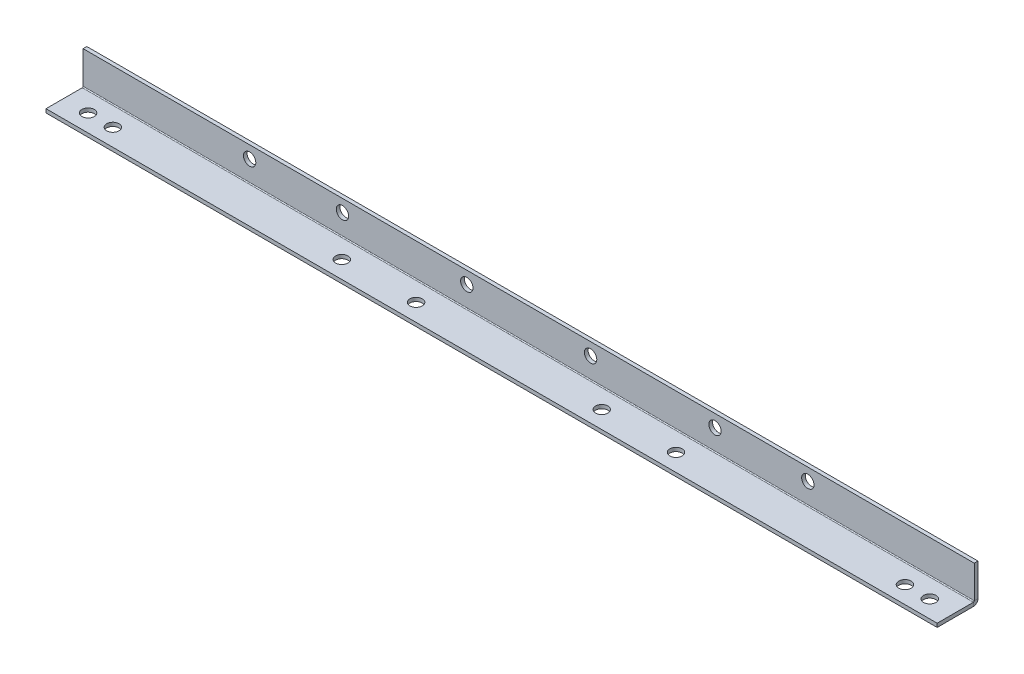
ISO-10303-21;
HEADER;
FILE_DESCRIPTION(('STEP AP214'),'2;1');
FILE_NAME('part.step','',(''),(''),'','','');
FILE_SCHEMA(('AUTOMOTIVE_DESIGN { 1 0 10303 214 1 1 1 1 }'));
ENDSEC;
DATA;
#1=APPLICATION_CONTEXT('core data for automotive mechanical design processes');
#2=APPLICATION_PROTOCOL_DEFINITION('international standard','automotive_design',2000,#1);
#3=PRODUCT_CONTEXT('',#1,'mechanical');
#4=PRODUCT('Part','Part','',(#3));
#5=PRODUCT_RELATED_PRODUCT_CATEGORY('part','',(#4));
#6=PRODUCT_DEFINITION_FORMATION('','',#4);
#7=PRODUCT_DEFINITION_CONTEXT('part definition',#1,'design');
#8=PRODUCT_DEFINITION('design','',#6,#7);
#9=PRODUCT_DEFINITION_SHAPE('','',#8);
#10=(LENGTH_UNIT() NAMED_UNIT(*) SI_UNIT(.MILLI.,.METRE.));
#11=(NAMED_UNIT(*) PLANE_ANGLE_UNIT() SI_UNIT($,.RADIAN.));
#12=(NAMED_UNIT(*) SI_UNIT($,.STERADIAN.) SOLID_ANGLE_UNIT());
#13=UNCERTAINTY_MEASURE_WITH_UNIT(LENGTH_MEASURE(1.E-05),#10,'distance_accuracy_value','');
#14=(GEOMETRIC_REPRESENTATION_CONTEXT(3) GLOBAL_UNCERTAINTY_ASSIGNED_CONTEXT((#13)) GLOBAL_UNIT_ASSIGNED_CONTEXT((#10,
#11,#12)) REPRESENTATION_CONTEXT('',''));
#15=CARTESIAN_POINT('',(0.,0.,0.));
#16=DIRECTION('',(0.,0.,1.));
#17=DIRECTION('',(1.,0.,0.));
#18=AXIS2_PLACEMENT_3D('',#15,#16,#17);
#19=CARTESIAN_POINT('',(-360.,-3.,15.));
#20=DIRECTION('',(-1.,0.,0.));
#21=DIRECTION('',(0.,0.,1.));
#22=AXIS2_PLACEMENT_3D('',#19,#20,#21);
#23=PLANE('',#22);
#24=DIRECTION('',(0.,0.,1.));
#25=VECTOR('',#24,1.);
#26=CARTESIAN_POINT('',(-360.,0.,15.));
#27=LINE('',#26,#25);
#28=CARTESIAN_POINT('',(-359.999999999999,0.,-14.2634));
#29=VERTEX_POINT('',#28);
#30=CARTESIAN_POINT('',(-360.,0.,15.));
#31=VERTEX_POINT('',#30);
#32=EDGE_CURVE('E90',#29,#31,#27,.T.);
#33=ORIENTED_EDGE('',*,*,#32,.F.);
#34=DIRECTION('',(0.,-1.,0.));
#35=VECTOR('',#34,1.);
#36=CARTESIAN_POINT('',(-359.999999999999,0.,-14.2634));
#37=LINE('',#36,#35);
#38=CARTESIAN_POINT('',(-359.999999999999,-3.00000000000001,-14.2634));
#39=VERTEX_POINT('',#38);
#40=EDGE_CURVE('E108',#29,#39,#37,.T.);
#41=ORIENTED_EDGE('',*,*,#40,.T.);
#42=DIRECTION('',(0.,0.,1.));
#43=VECTOR('',#42,1.);
#44=CARTESIAN_POINT('',(-360.,-3.,15.));
#45=LINE('',#44,#43);
#46=CARTESIAN_POINT('',(-360.,-3.,15.));
#47=VERTEX_POINT('',#46);
#48=EDGE_CURVE('E100',#39,#47,#45,.T.);
#49=ORIENTED_EDGE('',*,*,#48,.T.);
#50=DIRECTION('',(0.,1.,0.));
#51=VECTOR('',#50,1.);
#52=CARTESIAN_POINT('',(-360.,-3.,15.));
#53=LINE('',#52,#51);
#54=EDGE_CURVE('E44',#47,#31,#53,.T.);
#55=ORIENTED_EDGE('',*,*,#54,.T.);
#56=EDGE_LOOP('',(#33,#41,#49,#55));
#57=FACE_BOUND('',#56,.T.);
#58=ADVANCED_FACE('F40',(#57),#23,.T.);
#59=CARTESIAN_POINT('',(0.,-3.,0.));
#60=DIRECTION('',(0.,-1.,0.));
#61=DIRECTION('',(0.,0.,-1.));
#62=AXIS2_PLACEMENT_3D('',#59,#60,#61);
#63=PLANE('',#62);
#64=CARTESIAN_POINT('',(-135.,-3.,1.00000000000001));
#65=DIRECTION('',(0.,-1.,0.));
#66=DIRECTION('',(0.,0.,-1.));
#67=AXIS2_PLACEMENT_3D('',#64,#65,#66);
#68=CIRCLE('',#67,4.99999999999999);
#69=CARTESIAN_POINT('',(-135.,-3.,-3.99999999999998));
#70=VERTEX_POINT('',#69);
#71=EDGE_CURVE('E260',#70,#70,#68,.T.);
#72=ORIENTED_EDGE('',*,*,#71,.F.);
#73=EDGE_LOOP('',(#72));
#74=FACE_BOUND('',#73,.T.);
#75=CARTESIAN_POINT('',(135.,-3.,1.00000000000001));
#76=DIRECTION('',(0.,-1.,0.));
#77=DIRECTION('',(0.,0.,-1.));
#78=AXIS2_PLACEMENT_3D('',#75,#76,#77);
#79=CIRCLE('',#78,4.99999999999999);
#80=CARTESIAN_POINT('',(135.,-3.,-3.99999999999998));
#81=VERTEX_POINT('',#80);
#82=EDGE_CURVE('E267',#81,#81,#79,.T.);
#83=ORIENTED_EDGE('',*,*,#82,.F.);
#84=EDGE_LOOP('',(#83));
#85=FACE_BOUND('',#84,.T.);
#86=CARTESIAN_POINT('',(75.,-3.,1.00000000000001));
#87=DIRECTION('',(0.,-1.,0.));
#88=DIRECTION('',(0.,0.,-1.));
#89=AXIS2_PLACEMENT_3D('',#86,#87,#88);
#90=CIRCLE('',#89,5.);
#91=CARTESIAN_POINT('',(75.,-3.,-3.99999999999999));
#92=VERTEX_POINT('',#91);
#93=EDGE_CURVE('E271',#92,#92,#90,.T.);
#94=ORIENTED_EDGE('',*,*,#93,.F.);
#95=EDGE_LOOP('',(#94));
#96=FACE_BOUND('',#95,.T.);
#97=CARTESIAN_POINT('',(-75.,-3.,1.00000000000001));
#98=DIRECTION('',(0.,-1.,0.));
#99=DIRECTION('',(0.,0.,-1.));
#100=AXIS2_PLACEMENT_3D('',#97,#98,#99);
#101=CIRCLE('',#100,5.);
#102=CARTESIAN_POINT('',(-75.,-3.,-3.99999999999999));
#103=VERTEX_POINT('',#102);
#104=EDGE_CURVE('E275',#103,#103,#101,.T.);
#105=ORIENTED_EDGE('',*,*,#104,.F.);
#106=EDGE_LOOP('',(#105));
#107=FACE_BOUND('',#106,.T.);
#108=CARTESIAN_POINT('',(339.999999999999,-3.,1.00000000000001));
#109=DIRECTION('',(0.,-1.,0.));
#110=DIRECTION('',(0.,0.,-1.));
#111=AXIS2_PLACEMENT_3D('',#108,#109,#110);
#112=CIRCLE('',#111,4.99999999999999);
#113=CARTESIAN_POINT('',(339.999999999999,-3.,-3.99999999999998));
#114=VERTEX_POINT('',#113);
#115=EDGE_CURVE('E196',#114,#114,#112,.F.);
#116=ORIENTED_EDGE('',*,*,#115,.T.);
#117=EDGE_LOOP('',(#116));
#118=FACE_BOUND('',#117,.T.);
#119=CARTESIAN_POINT('',(319.999999999999,-3.,1.00000000000001));
#120=DIRECTION('',(0.,-1.,0.));
#121=DIRECTION('',(0.,0.,-1.));
#122=AXIS2_PLACEMENT_3D('',#119,#120,#121);
#123=CIRCLE('',#122,4.99999999999999);
#124=CARTESIAN_POINT('',(319.999999999999,-3.,-3.99999999999998));
#125=VERTEX_POINT('',#124);
#126=EDGE_CURVE('E203',#125,#125,#123,.F.);
#127=ORIENTED_EDGE('',*,*,#126,.T.);
#128=EDGE_LOOP('',(#127));
#129=FACE_BOUND('',#128,.T.);
#130=CARTESIAN_POINT('',(-339.999999999999,-3.,1.00000000000001));
#131=DIRECTION('',(0.,-1.,0.));
#132=DIRECTION('',(0.,0.,-1.));
#133=AXIS2_PLACEMENT_3D('',#130,#131,#132);
#134=CIRCLE('',#133,4.99999999999999);
#135=CARTESIAN_POINT('',(-339.999999999999,-3.,-3.99999999999998));
#136=VERTEX_POINT('',#135);
#137=EDGE_CURVE('E177',#136,#136,#134,.T.);
#138=ORIENTED_EDGE('',*,*,#137,.F.);
#139=EDGE_LOOP('',(#138));
#140=FACE_BOUND('',#139,.T.);
#141=CARTESIAN_POINT('',(-319.999999999999,-3.,1.00000000000001));
#142=DIRECTION('',(0.,-1.,0.));
#143=DIRECTION('',(0.,0.,-1.));
#144=AXIS2_PLACEMENT_3D('',#141,#142,#143);
#145=CIRCLE('',#144,4.99999999999999);
#146=CARTESIAN_POINT('',(-319.999999999999,-3.,-3.99999999999998));
#147=VERTEX_POINT('',#146);
#148=EDGE_CURVE('E187',#147,#147,#145,.T.);
#149=ORIENTED_EDGE('',*,*,#148,.F.);
#150=EDGE_LOOP('',(#149));
#151=FACE_BOUND('',#150,.T.);
#152=ORIENTED_EDGE('',*,*,#48,.F.);
#153=DIRECTION('',(-1.,0.,0.));
#154=VECTOR('',#153,1.);
#155=CARTESIAN_POINT('',(-359.999999999999,-3.00000000000001,-14.2634));
#156=LINE('',#155,#154);
#157=CARTESIAN_POINT('',(360.,-3.,-14.2634));
#158=VERTEX_POINT('',#157);
#159=EDGE_CURVE('E131',#39,#158,#156,.F.);
#160=ORIENTED_EDGE('',*,*,#159,.T.);
#161=DIRECTION('',(0.,0.,-1.));
#162=VECTOR('',#161,1.);
#163=CARTESIAN_POINT('',(360.,-3.,15.));
#164=LINE('',#163,#162);
#165=CARTESIAN_POINT('',(360.,-3.,15.));
#166=VERTEX_POINT('',#165);
#167=EDGE_CURVE('E96',#166,#158,#164,.T.);
#168=ORIENTED_EDGE('',*,*,#167,.F.);
#169=DIRECTION('',(1.,0.,0.));
#170=VECTOR('',#169,1.);
#171=CARTESIAN_POINT('',(-360.,-3.,15.));
#172=LINE('',#171,#170);
#173=EDGE_CURVE('E81',#47,#166,#172,.T.);
#174=ORIENTED_EDGE('',*,*,#173,.F.);
#175=EDGE_LOOP('',(#152,#160,#168,#174));
#176=FACE_BOUND('',#175,.T.);
#177=ADVANCED_FACE('F300',(#74,#85,#96,#107,#118,#129,#140,#151,#176),#63,.T.);
#178=CARTESIAN_POINT('',(0.,0.,0.));
#179=DIRECTION('',(0.,-1.,0.));
#180=DIRECTION('',(0.,0.,-1.));
#181=AXIS2_PLACEMENT_3D('',#178,#179,#180);
#182=PLANE('',#181);
#183=CARTESIAN_POINT('',(-135.,0.,1.00000000000001));
#184=DIRECTION('',(0.,1.,0.));
#185=DIRECTION('',(0.,0.,1.));
#186=AXIS2_PLACEMENT_3D('',#183,#184,#185);
#187=CIRCLE('',#186,4.99999999999999);
#188=CARTESIAN_POINT('',(-135.,0.,6.));
#189=VERTEX_POINT('',#188);
#190=EDGE_CURVE('E284',#189,#189,#187,.T.);
#191=ORIENTED_EDGE('',*,*,#190,.F.);
#192=EDGE_LOOP('',(#191));
#193=FACE_BOUND('',#192,.T.);
#194=CARTESIAN_POINT('',(135.,0.,1.00000000000001));
#195=DIRECTION('',(0.,1.,0.));
#196=DIRECTION('',(0.,0.,1.));
#197=AXIS2_PLACEMENT_3D('',#194,#195,#196);
#198=CIRCLE('',#197,4.99999999999999);
#199=CARTESIAN_POINT('',(135.,0.,6.));
#200=VERTEX_POINT('',#199);
#201=EDGE_CURVE('E288',#200,#200,#198,.T.);
#202=ORIENTED_EDGE('',*,*,#201,.F.);
#203=EDGE_LOOP('',(#202));
#204=FACE_BOUND('',#203,.T.);
#205=CARTESIAN_POINT('',(75.,0.,1.00000000000001));
#206=DIRECTION('',(0.,1.,0.));
#207=DIRECTION('',(0.,0.,1.));
#208=AXIS2_PLACEMENT_3D('',#205,#206,#207);
#209=CIRCLE('',#208,5.);
#210=CARTESIAN_POINT('',(75.,0.,6.00000000000002));
#211=VERTEX_POINT('',#210);
#212=EDGE_CURVE('E283',#211,#211,#209,.T.);
#213=ORIENTED_EDGE('',*,*,#212,.F.);
#214=EDGE_LOOP('',(#213));
#215=FACE_BOUND('',#214,.T.);
#216=CARTESIAN_POINT('',(-75.,0.,1.00000000000001));
#217=DIRECTION('',(0.,1.,0.));
#218=DIRECTION('',(0.,0.,1.));
#219=AXIS2_PLACEMENT_3D('',#216,#217,#218);
#220=CIRCLE('',#219,5.);
#221=CARTESIAN_POINT('',(-75.,0.,6.00000000000002));
#222=VERTEX_POINT('',#221);
#223=EDGE_CURVE('E279',#222,#222,#220,.T.);
#224=ORIENTED_EDGE('',*,*,#223,.F.);
#225=EDGE_LOOP('',(#224));
#226=FACE_BOUND('',#225,.T.);
#227=CARTESIAN_POINT('',(339.999999999999,0.,1.00000000000001));
#228=DIRECTION('',(0.,-1.,0.));
#229=DIRECTION('',(0.,0.,1.));
#230=AXIS2_PLACEMENT_3D('',#227,#228,#229);
#231=CIRCLE('',#230,4.99999999999999);
#232=CARTESIAN_POINT('',(339.999999999999,0.,6.));
#233=VERTEX_POINT('',#232);
#234=EDGE_CURVE('E207',#233,#233,#231,.T.);
#235=ORIENTED_EDGE('',*,*,#234,.T.);
#236=EDGE_LOOP('',(#235));
#237=FACE_BOUND('',#236,.T.);
#238=CARTESIAN_POINT('',(319.999999999999,0.,1.00000000000001));
#239=DIRECTION('',(0.,-1.,0.));
#240=DIRECTION('',(0.,0.,1.));
#241=AXIS2_PLACEMENT_3D('',#238,#239,#240);
#242=CIRCLE('',#241,4.99999999999999);
#243=CARTESIAN_POINT('',(319.999999999999,0.,6.));
#244=VERTEX_POINT('',#243);
#245=EDGE_CURVE('E208',#244,#244,#242,.T.);
#246=ORIENTED_EDGE('',*,*,#245,.T.);
#247=EDGE_LOOP('',(#246));
#248=FACE_BOUND('',#247,.T.);
#249=CARTESIAN_POINT('',(-339.999999999999,0.,1.00000000000001));
#250=DIRECTION('',(0.,1.,0.));
#251=DIRECTION('',(0.,0.,1.));
#252=AXIS2_PLACEMENT_3D('',#249,#250,#251);
#253=CIRCLE('',#252,4.99999999999999);
#254=CARTESIAN_POINT('',(-339.999999999999,0.,6.));
#255=VERTEX_POINT('',#254);
#256=EDGE_CURVE('E191',#255,#255,#253,.T.);
#257=ORIENTED_EDGE('',*,*,#256,.F.);
#258=EDGE_LOOP('',(#257));
#259=FACE_BOUND('',#258,.T.);
#260=CARTESIAN_POINT('',(-319.999999999999,0.,1.00000000000001));
#261=DIRECTION('',(0.,1.,0.));
#262=DIRECTION('',(0.,0.,1.));
#263=AXIS2_PLACEMENT_3D('',#260,#261,#262);
#264=CIRCLE('',#263,4.99999999999999);
#265=CARTESIAN_POINT('',(-319.999999999999,0.,6.));
#266=VERTEX_POINT('',#265);
#267=EDGE_CURVE('E192',#266,#266,#264,.T.);
#268=ORIENTED_EDGE('',*,*,#267,.F.);
#269=EDGE_LOOP('',(#268));
#270=FACE_BOUND('',#269,.T.);
#271=DIRECTION('',(-1.,0.,0.));
#272=VECTOR('',#271,1.);
#273=CARTESIAN_POINT('',(-359.999999999999,0.,-14.2634));
#274=LINE('',#273,#272);
#275=CARTESIAN_POINT('',(360.,0.,-14.2634));
#276=VERTEX_POINT('',#275);
#277=EDGE_CURVE('E118',#29,#276,#274,.F.);
#278=ORIENTED_EDGE('',*,*,#277,.F.);
#279=ORIENTED_EDGE('',*,*,#32,.T.);
#280=DIRECTION('',(1.,0.,0.));
#281=VECTOR('',#280,1.);
#282=CARTESIAN_POINT('',(-360.,0.,15.));
#283=LINE('',#282,#281);
#284=CARTESIAN_POINT('',(360.,0.,15.));
#285=VERTEX_POINT('',#284);
#286=EDGE_CURVE('E79',#31,#285,#283,.T.);
#287=ORIENTED_EDGE('',*,*,#286,.T.);
#288=DIRECTION('',(0.,0.,-1.));
#289=VECTOR('',#288,1.);
#290=CARTESIAN_POINT('',(360.,0.,15.));
#291=LINE('',#290,#289);
#292=EDGE_CURVE('E84',#285,#276,#291,.T.);
#293=ORIENTED_EDGE('',*,*,#292,.T.);
#294=EDGE_LOOP('',(#278,#279,#287,#293));
#295=FACE_BOUND('',#294,.T.);
#296=ADVANCED_FACE('F92',(#193,#204,#215,#226,#237,#248,#259,#270,#295),#182,.F.);
#297=CARTESIAN_POINT('',(360.,-3.,15.));
#298=DIRECTION('',(1.,0.,0.));
#299=DIRECTION('',(0.,0.,-1.));
#300=AXIS2_PLACEMENT_3D('',#297,#298,#299);
#301=PLANE('',#300);
#302=DIRECTION('',(0.,-1.,0.));
#303=VECTOR('',#302,1.);
#304=CARTESIAN_POINT('',(360.,0.,-14.2634));
#305=LINE('',#304,#303);
#306=EDGE_CURVE('E86',#276,#158,#305,.T.);
#307=ORIENTED_EDGE('',*,*,#306,.F.);
#308=ORIENTED_EDGE('',*,*,#292,.F.);
#309=DIRECTION('',(0.,1.,0.));
#310=VECTOR('',#309,1.);
#311=CARTESIAN_POINT('',(360.,-3.,15.));
#312=LINE('',#311,#310);
#313=EDGE_CURVE('E11',#166,#285,#312,.T.);
#314=ORIENTED_EDGE('',*,*,#313,.F.);
#315=ORIENTED_EDGE('',*,*,#167,.T.);
#316=EDGE_LOOP('',(#307,#308,#314,#315));
#317=FACE_BOUND('',#316,.T.);
#318=ADVANCED_FACE('F42',(#317),#301,.T.);
#319=CARTESIAN_POINT('',(-360.,-3.,15.));
#320=DIRECTION('',(0.,0.,1.));
#321=DIRECTION('',(1.,0.,0.));
#322=AXIS2_PLACEMENT_3D('',#319,#320,#321);
#323=PLANE('',#322);
#324=ORIENTED_EDGE('',*,*,#286,.F.);
#325=ORIENTED_EDGE('',*,*,#54,.F.);
#326=ORIENTED_EDGE('',*,*,#173,.T.);
#327=ORIENTED_EDGE('',*,*,#313,.T.);
#328=EDGE_LOOP('',(#324,#325,#326,#327));
#329=FACE_BOUND('',#328,.T.);
#330=ADVANCED_FACE('F76',(#329),#323,.T.);
#331=CARTESIAN_POINT('',(360.,0.736599999999992,-14.2634));
#332=DIRECTION('',(1.,0.,0.));
#333=DIRECTION('',(0.,0.,-1.));
#334=AXIS2_PLACEMENT_3D('',#331,#332,#333);
#335=PLANE('',#334);
#336=DIRECTION('',(0.,0.,-1.));
#337=VECTOR('',#336,1.);
#338=CARTESIAN_POINT('',(360.,0.736599999999997,-15.));
#339=LINE('',#338,#337);
#340=CARTESIAN_POINT('',(360.,0.736599999999989,-15.));
#341=VERTEX_POINT('',#340);
#342=CARTESIAN_POINT('',(360.,0.736599999999979,-18.));
#343=VERTEX_POINT('',#342);
#344=EDGE_CURVE('E172',#341,#343,#339,.T.);
#345=ORIENTED_EDGE('',*,*,#344,.F.);
#346=CARTESIAN_POINT('',(360.,0.736599999999992,-14.2634));
#347=DIRECTION('',(-1.,0.,0.));
#348=DIRECTION('',(0.,0.,1.));
#349=AXIS2_PLACEMENT_3D('',#346,#347,#348);
#350=CIRCLE('',#349,0.7366);
#351=EDGE_CURVE('E123',#276,#341,#350,.F.);
#352=ORIENTED_EDGE('',*,*,#351,.F.);
#353=ORIENTED_EDGE('',*,*,#306,.T.);
#354=CARTESIAN_POINT('',(360.,0.736599999999992,-14.2634));
#355=DIRECTION('',(-1.,0.,0.));
#356=DIRECTION('',(0.,0.,1.));
#357=AXIS2_PLACEMENT_3D('',#354,#355,#356);
#358=CIRCLE('',#357,3.7366);
#359=EDGE_CURVE('E56',#158,#343,#358,.F.);
#360=ORIENTED_EDGE('',*,*,#359,.T.);
#361=EDGE_LOOP('',(#345,#352,#353,#360));
#362=FACE_BOUND('',#361,.T.);
#363=ADVANCED_FACE('F339',(#362),#335,.T.);
#364=CARTESIAN_POINT('',(-359.999999999999,0.736599999999992,-14.2634));
#365=DIRECTION('',(1.,0.,0.));
#366=DIRECTION('',(0.,0.,-1.));
#367=AXIS2_PLACEMENT_3D('',#364,#365,#366);
#368=PLANE('',#367);
#369=CARTESIAN_POINT('',(-359.999999999999,0.736599999999992,-14.2634));
#370=DIRECTION('',(-1.,0.,0.));
#371=DIRECTION('',(0.,0.,1.));
#372=AXIS2_PLACEMENT_3D('',#369,#370,#371);
#373=CIRCLE('',#372,0.7366);
#374=CARTESIAN_POINT('',(-359.999999999999,0.736599999999989,-15.));
#375=VERTEX_POINT('',#374);
#376=EDGE_CURVE('E114',#375,#29,#373,.T.);
#377=ORIENTED_EDGE('',*,*,#376,.F.);
#378=DIRECTION('',(0.,0.,-1.));
#379=VECTOR('',#378,1.);
#380=CARTESIAN_POINT('',(-359.999999999999,0.736599999999997,-15.));
#381=LINE('',#380,#379);
#382=CARTESIAN_POINT('',(-359.999999999999,0.736600000000018,-18.));
#383=VERTEX_POINT('',#382);
#384=EDGE_CURVE('E171',#375,#383,#381,.T.);
#385=ORIENTED_EDGE('',*,*,#384,.T.);
#386=CARTESIAN_POINT('',(-359.999999999999,0.736599999999992,-14.2634));
#387=DIRECTION('',(-1.,0.,0.));
#388=DIRECTION('',(0.,0.,1.));
#389=AXIS2_PLACEMENT_3D('',#386,#387,#388);
#390=CIRCLE('',#389,3.7366);
#391=EDGE_CURVE('E127',#383,#39,#390,.T.);
#392=ORIENTED_EDGE('',*,*,#391,.T.);
#393=ORIENTED_EDGE('',*,*,#40,.F.);
#394=EDGE_LOOP('',(#377,#385,#392,#393));
#395=FACE_BOUND('',#394,.T.);
#396=ADVANCED_FACE('F341',(#395),#368,.F.);
#397=CARTESIAN_POINT('',(-359.999999999999,0.736599999999992,-14.2634));
#398=DIRECTION('',(-1.,0.,0.));
#399=DIRECTION('',(0.,0.,-1.));
#400=AXIS2_PLACEMENT_3D('',#397,#398,#399);
#401=CYLINDRICAL_SURFACE('',#400,3.7366);
#402=ORIENTED_EDGE('',*,*,#159,.F.);
#403=ORIENTED_EDGE('',*,*,#391,.F.);
#404=DIRECTION('',(1.,0.,0.));
#405=VECTOR('',#404,1.);
#406=CARTESIAN_POINT('',(0.,0.736600000000018,-18.));
#407=LINE('',#406,#405);
#408=EDGE_CURVE('E158',#383,#343,#407,.T.);
#409=ORIENTED_EDGE('',*,*,#408,.T.);
#410=ORIENTED_EDGE('',*,*,#359,.F.);
#411=EDGE_LOOP('',(#402,#403,#409,#410));
#412=FACE_BOUND('',#411,.T.);
#413=ADVANCED_FACE('F344',(#412),#401,.T.);
#414=CARTESIAN_POINT('',(-359.999999999999,0.736599999999992,-14.2634));
#415=DIRECTION('',(-1.,0.,0.));
#416=DIRECTION('',(0.,0.,-1.));
#417=AXIS2_PLACEMENT_3D('',#414,#415,#416);
#418=CYLINDRICAL_SURFACE('',#417,0.7366);
#419=ORIENTED_EDGE('',*,*,#277,.T.);
#420=ORIENTED_EDGE('',*,*,#351,.T.);
#421=DIRECTION('',(-1.,0.,0.));
#422=VECTOR('',#421,1.);
#423=CARTESIAN_POINT('',(360.,0.736599999999997,-15.));
#424=LINE('',#423,#422);
#425=EDGE_CURVE('E176',#341,#375,#424,.T.);
#426=ORIENTED_EDGE('',*,*,#425,.T.);
#427=ORIENTED_EDGE('',*,*,#376,.T.);
#428=EDGE_LOOP('',(#419,#420,#426,#427));
#429=FACE_BOUND('',#428,.T.);
#430=ADVANCED_FACE('F349',(#429),#418,.F.);
#431=CARTESIAN_POINT('',(-359.999999999999,27.,-18.0000000000001));
#432=DIRECTION('',(1.,0.,0.));
#433=DIRECTION('',(0.,0.,-1.));
#434=AXIS2_PLACEMENT_3D('',#431,#432,#433);
#435=PLANE('',#434);
#436=ORIENTED_EDGE('',*,*,#384,.F.);
#437=DIRECTION('',(0.,1.,0.));
#438=VECTOR('',#437,1.);
#439=CARTESIAN_POINT('',(-359.999999999999,27.,-15.0000000000001));
#440=LINE('',#439,#438);
#441=CARTESIAN_POINT('',(-359.999999999999,27.,-15.0000000000001));
#442=VERTEX_POINT('',#441);
#443=EDGE_CURVE('E154',#375,#442,#440,.T.);
#444=ORIENTED_EDGE('',*,*,#443,.T.);
#445=DIRECTION('',(0.,0.,1.));
#446=VECTOR('',#445,1.);
#447=CARTESIAN_POINT('',(-359.999999999999,27.,-18.0000000000001));
#448=LINE('',#447,#446);
#449=CARTESIAN_POINT('',(-359.999999999999,27.,-18.0000000000001));
#450=VERTEX_POINT('',#449);
#451=EDGE_CURVE('E119',#450,#442,#448,.T.);
#452=ORIENTED_EDGE('',*,*,#451,.F.);
#453=DIRECTION('',(0.,1.,0.));
#454=VECTOR('',#453,1.);
#455=CARTESIAN_POINT('',(-359.999999999999,27.,-18.0000000000001));
#456=LINE('',#455,#454);
#457=EDGE_CURVE('E149',#383,#450,#456,.T.);
#458=ORIENTED_EDGE('',*,*,#457,.F.);
#459=EDGE_LOOP('',(#436,#444,#452,#458));
#460=FACE_BOUND('',#459,.T.);
#461=ADVANCED_FACE('F352',(#460),#435,.F.);
#462=CARTESIAN_POINT('',(360.,0.,-18.));
#463=DIRECTION('',(-1.,0.,0.));
#464=DIRECTION('',(0.,0.,1.));
#465=AXIS2_PLACEMENT_3D('',#462,#463,#464);
#466=PLANE('',#465);
#467=ORIENTED_EDGE('',*,*,#344,.T.);
#468=DIRECTION('',(0.,-1.,0.));
#469=VECTOR('',#468,1.);
#470=CARTESIAN_POINT('',(360.,0.,-18.));
#471=LINE('',#470,#469);
#472=CARTESIAN_POINT('',(360.,27.,-18.0000000000001));
#473=VERTEX_POINT('',#472);
#474=EDGE_CURVE('E144',#473,#343,#471,.T.);
#475=ORIENTED_EDGE('',*,*,#474,.F.);
#476=DIRECTION('',(0.,0.,1.));
#477=VECTOR('',#476,1.);
#478=CARTESIAN_POINT('',(360.,27.,-18.0000000000001));
#479=LINE('',#478,#477);
#480=CARTESIAN_POINT('',(360.,27.,-15.0000000000001));
#481=VERTEX_POINT('',#480);
#482=EDGE_CURVE('E140',#473,#481,#479,.T.);
#483=ORIENTED_EDGE('',*,*,#482,.T.);
#484=DIRECTION('',(0.,-1.,0.));
#485=VECTOR('',#484,1.);
#486=CARTESIAN_POINT('',(360.,0.,-15.));
#487=LINE('',#486,#485);
#488=EDGE_CURVE('E145',#481,#341,#487,.T.);
#489=ORIENTED_EDGE('',*,*,#488,.T.);
#490=EDGE_LOOP('',(#467,#475,#483,#489));
#491=FACE_BOUND('',#490,.T.);
#492=ADVANCED_FACE('F357',(#491),#466,.F.);
#493=CARTESIAN_POINT('',(0.,0.,-18.));
#494=DIRECTION('',(0.,0.,1.));
#495=DIRECTION('',(0.,-1.,0.));
#496=AXIS2_PLACEMENT_3D('',#493,#494,#495);
#497=PLANE('',#496);
#498=CARTESIAN_POINT('',(225.5,17.,-18.0000000000001));
#499=DIRECTION('',(0.,0.,1.));
#500=DIRECTION('',(0.,-1.,0.));
#501=AXIS2_PLACEMENT_3D('',#498,#499,#500);
#502=CIRCLE('',#501,4.99999999999999);
#503=CARTESIAN_POINT('',(225.5,12.0000000000001,-18.0000000000001));
#504=VERTEX_POINT('',#503);
#505=EDGE_CURVE('E212',#504,#504,#502,.T.);
#506=ORIENTED_EDGE('',*,*,#505,.T.);
#507=EDGE_LOOP('',(#506));
#508=FACE_BOUND('',#507,.T.);
#509=CARTESIAN_POINT('',(-50.,17.,-18.0000000000001));
#510=DIRECTION('',(0.,0.,1.));
#511=DIRECTION('',(0.,-1.,0.));
#512=AXIS2_PLACEMENT_3D('',#509,#510,#511);
#513=CIRCLE('',#512,5.);
#514=CARTESIAN_POINT('',(-50.,12.,-18.0000000000001));
#515=VERTEX_POINT('',#514);
#516=EDGE_CURVE('E219',#515,#515,#513,.T.);
#517=ORIENTED_EDGE('',*,*,#516,.T.);
#518=EDGE_LOOP('',(#517));
#519=FACE_BOUND('',#518,.T.);
#520=CARTESIAN_POINT('',(50.,17.,-18.0000000000001));
#521=DIRECTION('',(0.,0.,1.));
#522=DIRECTION('',(0.,-1.,0.));
#523=AXIS2_PLACEMENT_3D('',#520,#521,#522);
#524=CIRCLE('',#523,5.);
#525=CARTESIAN_POINT('',(50.,12.,-18.0000000000001));
#526=VERTEX_POINT('',#525);
#527=EDGE_CURVE('E223',#526,#526,#524,.T.);
#528=ORIENTED_EDGE('',*,*,#527,.T.);
#529=EDGE_LOOP('',(#528));
#530=FACE_BOUND('',#529,.T.);
#531=CARTESIAN_POINT('',(150.5,17.0000000000001,-18.0000000000001));
#532=DIRECTION('',(0.,0.,1.));
#533=DIRECTION('',(0.,-1.,0.));
#534=AXIS2_PLACEMENT_3D('',#531,#532,#533);
#535=CIRCLE('',#534,4.99999999999999);
#536=CARTESIAN_POINT('',(150.5,12.0000000000001,-18.0000000000001));
#537=VERTEX_POINT('',#536);
#538=EDGE_CURVE('E227',#537,#537,#535,.T.);
#539=ORIENTED_EDGE('',*,*,#538,.T.);
#540=EDGE_LOOP('',(#539));
#541=FACE_BOUND('',#540,.T.);
#542=CARTESIAN_POINT('',(-150.499999999999,17.,-18.0000000000001));
#543=DIRECTION('',(0.,0.,1.));
#544=DIRECTION('',(0.,-1.,0.));
#545=AXIS2_PLACEMENT_3D('',#542,#543,#544);
#546=CIRCLE('',#545,4.99999999999999);
#547=CARTESIAN_POINT('',(-150.499999999999,12.,-18.0000000000001));
#548=VERTEX_POINT('',#547);
#549=EDGE_CURVE('E231',#548,#548,#546,.T.);
#550=ORIENTED_EDGE('',*,*,#549,.T.);
#551=EDGE_LOOP('',(#550));
#552=FACE_BOUND('',#551,.T.);
#553=CARTESIAN_POINT('',(-225.499999999999,17.,-18.0000000000001));
#554=DIRECTION('',(0.,0.,1.));
#555=DIRECTION('',(0.,-1.,0.));
#556=AXIS2_PLACEMENT_3D('',#553,#554,#555);
#557=CIRCLE('',#556,4.99999999999999);
#558=CARTESIAN_POINT('',(-225.499999999999,12.,-18.0000000000001));
#559=VERTEX_POINT('',#558);
#560=EDGE_CURVE('E235',#559,#559,#557,.T.);
#561=ORIENTED_EDGE('',*,*,#560,.T.);
#562=EDGE_LOOP('',(#561));
#563=FACE_BOUND('',#562,.T.);
#564=ORIENTED_EDGE('',*,*,#408,.F.);
#565=ORIENTED_EDGE('',*,*,#457,.T.);
#566=DIRECTION('',(1.,0.,0.));
#567=VECTOR('',#566,1.);
#568=CARTESIAN_POINT('',(360.,27.,-18.0000000000001));
#569=LINE('',#568,#567);
#570=EDGE_CURVE('E162',#450,#473,#569,.T.);
#571=ORIENTED_EDGE('',*,*,#570,.T.);
#572=ORIENTED_EDGE('',*,*,#474,.T.);
#573=EDGE_LOOP('',(#564,#565,#571,#572));
#574=FACE_BOUND('',#573,.T.);
#575=ADVANCED_FACE('F362',(#508,#519,#530,#541,#552,#563,#574),#497,.F.);
#576=CARTESIAN_POINT('',(0.,0.,-15.));
#577=DIRECTION('',(0.,0.,1.));
#578=DIRECTION('',(0.,-1.,0.));
#579=AXIS2_PLACEMENT_3D('',#576,#577,#578);
#580=PLANE('',#579);
#581=CARTESIAN_POINT('',(225.5,17.,-15.));
#582=DIRECTION('',(0.,0.,1.));
#583=DIRECTION('',(1.,0.,0.));
#584=AXIS2_PLACEMENT_3D('',#581,#582,#583);
#585=CIRCLE('',#584,4.99999999999999);
#586=CARTESIAN_POINT('',(230.5,17.,-15.));
#587=VERTEX_POINT('',#586);
#588=EDGE_CURVE('E239',#587,#587,#585,.T.);
#589=ORIENTED_EDGE('',*,*,#588,.F.);
#590=EDGE_LOOP('',(#589));
#591=FACE_BOUND('',#590,.T.);
#592=CARTESIAN_POINT('',(-50.,17.,-15.));
#593=DIRECTION('',(0.,0.,1.));
#594=DIRECTION('',(1.,0.,0.));
#595=AXIS2_PLACEMENT_3D('',#592,#593,#594);
#596=CIRCLE('',#595,5.);
#597=CARTESIAN_POINT('',(-45.,17.,-15.));
#598=VERTEX_POINT('',#597);
#599=EDGE_CURVE('E245',#598,#598,#596,.T.);
#600=ORIENTED_EDGE('',*,*,#599,.F.);
#601=EDGE_LOOP('',(#600));
#602=FACE_BOUND('',#601,.T.);
#603=CARTESIAN_POINT('',(50.,17.,-15.));
#604=DIRECTION('',(0.,0.,1.));
#605=DIRECTION('',(1.,0.,0.));
#606=AXIS2_PLACEMENT_3D('',#603,#604,#605);
#607=CIRCLE('',#606,5.);
#608=CARTESIAN_POINT('',(55.,17.,-15.));
#609=VERTEX_POINT('',#608);
#610=EDGE_CURVE('E240',#609,#609,#607,.T.);
#611=ORIENTED_EDGE('',*,*,#610,.F.);
#612=EDGE_LOOP('',(#611));
#613=FACE_BOUND('',#612,.T.);
#614=CARTESIAN_POINT('',(150.5,17.0000000000001,-15.));
#615=DIRECTION('',(0.,0.,1.));
#616=DIRECTION('',(1.,0.,0.));
#617=AXIS2_PLACEMENT_3D('',#614,#615,#616);
#618=CIRCLE('',#617,4.99999999999999);
#619=CARTESIAN_POINT('',(155.5,17.0000000000001,-15.));
#620=VERTEX_POINT('',#619);
#621=EDGE_CURVE('E244',#620,#620,#618,.T.);
#622=ORIENTED_EDGE('',*,*,#621,.F.);
#623=EDGE_LOOP('',(#622));
#624=FACE_BOUND('',#623,.T.);
#625=CARTESIAN_POINT('',(-150.499999999999,17.,-15.));
#626=DIRECTION('',(0.,0.,1.));
#627=DIRECTION('',(1.,0.,0.));
#628=AXIS2_PLACEMENT_3D('',#625,#626,#627);
#629=CIRCLE('',#628,4.99999999999999);
#630=CARTESIAN_POINT('',(-145.499999999999,17.,-15.));
#631=VERTEX_POINT('',#630);
#632=EDGE_CURVE('E249',#631,#631,#629,.T.);
#633=ORIENTED_EDGE('',*,*,#632,.F.);
#634=EDGE_LOOP('',(#633));
#635=FACE_BOUND('',#634,.T.);
#636=CARTESIAN_POINT('',(-225.499999999999,17.,-15.));
#637=DIRECTION('',(0.,0.,1.));
#638=DIRECTION('',(1.,0.,0.));
#639=AXIS2_PLACEMENT_3D('',#636,#637,#638);
#640=CIRCLE('',#639,4.99999999999999);
#641=CARTESIAN_POINT('',(-220.499999999999,17.,-15.));
#642=VERTEX_POINT('',#641);
#643=EDGE_CURVE('E253',#642,#642,#640,.T.);
#644=ORIENTED_EDGE('',*,*,#643,.F.);
#645=EDGE_LOOP('',(#644));
#646=FACE_BOUND('',#645,.T.);
#647=ORIENTED_EDGE('',*,*,#443,.F.);
#648=ORIENTED_EDGE('',*,*,#425,.F.);
#649=ORIENTED_EDGE('',*,*,#488,.F.);
#650=DIRECTION('',(1.,0.,0.));
#651=VECTOR('',#650,1.);
#652=CARTESIAN_POINT('',(360.,27.,-15.0000000000001));
#653=LINE('',#652,#651);
#654=EDGE_CURVE('E150',#442,#481,#653,.T.);
#655=ORIENTED_EDGE('',*,*,#654,.F.);
#656=EDGE_LOOP('',(#647,#648,#649,#655));
#657=FACE_BOUND('',#656,.T.);
#658=ADVANCED_FACE('F326',(#591,#602,#613,#624,#635,#646,#657),#580,.T.);
#659=CARTESIAN_POINT('',(360.,27.,-18.0000000000001));
#660=DIRECTION('',(0.,-1.,0.));
#661=DIRECTION('',(0.,0.,-1.));
#662=AXIS2_PLACEMENT_3D('',#659,#660,#661);
#663=PLANE('',#662);
#664=ORIENTED_EDGE('',*,*,#654,.T.);
#665=ORIENTED_EDGE('',*,*,#482,.F.);
#666=ORIENTED_EDGE('',*,*,#570,.F.);
#667=ORIENTED_EDGE('',*,*,#451,.T.);
#668=EDGE_LOOP('',(#664,#665,#666,#667));
#669=FACE_BOUND('',#668,.T.);
#670=ADVANCED_FACE('F316',(#669),#663,.F.);
#671=CARTESIAN_POINT('',(-319.999999999999,-10.,1.00000000000001));
#672=DIRECTION('',(0.,1.,0.));
#673=DIRECTION('',(0.,0.,1.));
#674=AXIS2_PLACEMENT_3D('',#671,#672,#673);
#675=CYLINDRICAL_SURFACE('',#674,4.99999999999999);
#676=ORIENTED_EDGE('',*,*,#148,.T.);
#677=EDGE_LOOP('',(#676));
#678=FACE_BOUND('',#677,.T.);
#679=ORIENTED_EDGE('',*,*,#267,.T.);
#680=EDGE_LOOP('',(#679));
#681=FACE_BOUND('',#680,.T.);
#682=ADVANCED_FACE('F313',(#678,#681),#675,.F.);
#683=CARTESIAN_POINT('',(-339.999999999999,-10.,1.00000000000001));
#684=DIRECTION('',(0.,1.,0.));
#685=DIRECTION('',(0.,0.,1.));
#686=AXIS2_PLACEMENT_3D('',#683,#684,#685);
#687=CYLINDRICAL_SURFACE('',#686,4.99999999999999);
#688=ORIENTED_EDGE('',*,*,#137,.T.);
#689=EDGE_LOOP('',(#688));
#690=FACE_BOUND('',#689,.T.);
#691=ORIENTED_EDGE('',*,*,#256,.T.);
#692=EDGE_LOOP('',(#691));
#693=FACE_BOUND('',#692,.T.);
#694=ADVANCED_FACE('F315',(#690,#693),#687,.F.);
#695=CARTESIAN_POINT('',(319.999999999999,-10.,1.00000000000001));
#696=DIRECTION('',(0.,1.,0.));
#697=DIRECTION('',(0.,0.,1.));
#698=AXIS2_PLACEMENT_3D('',#695,#696,#697);
#699=CYLINDRICAL_SURFACE('',#698,4.99999999999999);
#700=ORIENTED_EDGE('',*,*,#126,.F.);
#701=EDGE_LOOP('',(#700));
#702=FACE_BOUND('',#701,.T.);
#703=ORIENTED_EDGE('',*,*,#245,.F.);
#704=EDGE_LOOP('',(#703));
#705=FACE_BOUND('',#704,.T.);
#706=ADVANCED_FACE('F323',(#702,#705),#699,.F.);
#707=CARTESIAN_POINT('',(339.999999999999,-10.,1.00000000000001));
#708=DIRECTION('',(0.,1.,0.));
#709=DIRECTION('',(0.,0.,1.));
#710=AXIS2_PLACEMENT_3D('',#707,#708,#709);
#711=CYLINDRICAL_SURFACE('',#710,4.99999999999999);
#712=ORIENTED_EDGE('',*,*,#115,.F.);
#713=EDGE_LOOP('',(#712));
#714=FACE_BOUND('',#713,.T.);
#715=ORIENTED_EDGE('',*,*,#234,.F.);
#716=EDGE_LOOP('',(#715));
#717=FACE_BOUND('',#716,.T.);
#718=ADVANCED_FACE('F425',(#714,#717),#711,.F.);
#719=CARTESIAN_POINT('',(-225.499999999999,17.,-25.));
#720=DIRECTION('',(0.,0.,1.));
#721=DIRECTION('',(1.,0.,0.));
#722=AXIS2_PLACEMENT_3D('',#719,#720,#721);
#723=CYLINDRICAL_SURFACE('',#722,4.99999999999999);
#724=ORIENTED_EDGE('',*,*,#643,.T.);
#725=EDGE_LOOP('',(#724));
#726=FACE_BOUND('',#725,.T.);
#727=ORIENTED_EDGE('',*,*,#560,.F.);
#728=EDGE_LOOP('',(#727));
#729=FACE_BOUND('',#728,.T.);
#730=ADVANCED_FACE('F422',(#726,#729),#723,.F.);
#731=CARTESIAN_POINT('',(-150.499999999999,17.,-25.));
#732=DIRECTION('',(0.,0.,1.));
#733=DIRECTION('',(1.,0.,0.));
#734=AXIS2_PLACEMENT_3D('',#731,#732,#733);
#735=CYLINDRICAL_SURFACE('',#734,4.99999999999999);
#736=ORIENTED_EDGE('',*,*,#632,.T.);
#737=EDGE_LOOP('',(#736));
#738=FACE_BOUND('',#737,.T.);
#739=ORIENTED_EDGE('',*,*,#549,.F.);
#740=EDGE_LOOP('',(#739));
#741=FACE_BOUND('',#740,.T.);
#742=ADVANCED_FACE('F424',(#738,#741),#735,.F.);
#743=CARTESIAN_POINT('',(150.5,17.0000000000001,-25.));
#744=DIRECTION('',(0.,0.,1.));
#745=DIRECTION('',(1.,0.,0.));
#746=AXIS2_PLACEMENT_3D('',#743,#744,#745);
#747=CYLINDRICAL_SURFACE('',#746,4.99999999999999);
#748=ORIENTED_EDGE('',*,*,#621,.T.);
#749=EDGE_LOOP('',(#748));
#750=FACE_BOUND('',#749,.T.);
#751=ORIENTED_EDGE('',*,*,#538,.F.);
#752=EDGE_LOOP('',(#751));
#753=FACE_BOUND('',#752,.T.);
#754=ADVANCED_FACE('F432',(#750,#753),#747,.F.);
#755=CARTESIAN_POINT('',(50.,17.,-25.));
#756=DIRECTION('',(0.,0.,1.));
#757=DIRECTION('',(1.,0.,0.));
#758=AXIS2_PLACEMENT_3D('',#755,#756,#757);
#759=CYLINDRICAL_SURFACE('',#758,5.);
#760=ORIENTED_EDGE('',*,*,#610,.T.);
#761=EDGE_LOOP('',(#760));
#762=FACE_BOUND('',#761,.T.);
#763=ORIENTED_EDGE('',*,*,#527,.F.);
#764=EDGE_LOOP('',(#763));
#765=FACE_BOUND('',#764,.T.);
#766=ADVANCED_FACE('F443',(#762,#765),#759,.F.);
#767=CARTESIAN_POINT('',(-50.,17.,-25.));
#768=DIRECTION('',(0.,0.,1.));
#769=DIRECTION('',(1.,0.,0.));
#770=AXIS2_PLACEMENT_3D('',#767,#768,#769);
#771=CYLINDRICAL_SURFACE('',#770,5.);
#772=ORIENTED_EDGE('',*,*,#599,.T.);
#773=EDGE_LOOP('',(#772));
#774=FACE_BOUND('',#773,.T.);
#775=ORIENTED_EDGE('',*,*,#516,.F.);
#776=EDGE_LOOP('',(#775));
#777=FACE_BOUND('',#776,.T.);
#778=ADVANCED_FACE('F438',(#774,#777),#771,.F.);
#779=CARTESIAN_POINT('',(225.5,17.,-25.));
#780=DIRECTION('',(0.,0.,1.));
#781=DIRECTION('',(1.,0.,0.));
#782=AXIS2_PLACEMENT_3D('',#779,#780,#781);
#783=CYLINDRICAL_SURFACE('',#782,4.99999999999999);
#784=ORIENTED_EDGE('',*,*,#588,.T.);
#785=EDGE_LOOP('',(#784));
#786=FACE_BOUND('',#785,.T.);
#787=ORIENTED_EDGE('',*,*,#505,.F.);
#788=EDGE_LOOP('',(#787));
#789=FACE_BOUND('',#788,.T.);
#790=ADVANCED_FACE('F516',(#786,#789),#783,.F.);
#791=CARTESIAN_POINT('',(-75.,-10.,1.00000000000001));
#792=DIRECTION('',(0.,1.,0.));
#793=DIRECTION('',(0.,0.,1.));
#794=AXIS2_PLACEMENT_3D('',#791,#792,#793);
#795=CYLINDRICAL_SURFACE('',#794,5.);
#796=ORIENTED_EDGE('',*,*,#104,.T.);
#797=EDGE_LOOP('',(#796));
#798=FACE_BOUND('',#797,.T.);
#799=ORIENTED_EDGE('',*,*,#223,.T.);
#800=EDGE_LOOP('',(#799));
#801=FACE_BOUND('',#800,.T.);
#802=ADVANCED_FACE('F526',(#798,#801),#795,.F.);
#803=CARTESIAN_POINT('',(75.,-10.,1.00000000000001));
#804=DIRECTION('',(0.,1.,0.));
#805=DIRECTION('',(0.,0.,1.));
#806=AXIS2_PLACEMENT_3D('',#803,#804,#805);
#807=CYLINDRICAL_SURFACE('',#806,5.);
#808=ORIENTED_EDGE('',*,*,#93,.T.);
#809=EDGE_LOOP('',(#808));
#810=FACE_BOUND('',#809,.T.);
#811=ORIENTED_EDGE('',*,*,#212,.T.);
#812=EDGE_LOOP('',(#811));
#813=FACE_BOUND('',#812,.T.);
#814=ADVANCED_FACE('F296',(#810,#813),#807,.F.);
#815=CARTESIAN_POINT('',(135.,-10.,1.00000000000001));
#816=DIRECTION('',(0.,1.,0.));
#817=DIRECTION('',(0.,0.,1.));
#818=AXIS2_PLACEMENT_3D('',#815,#816,#817);
#819=CYLINDRICAL_SURFACE('',#818,4.99999999999999);
#820=ORIENTED_EDGE('',*,*,#82,.T.);
#821=EDGE_LOOP('',(#820));
#822=FACE_BOUND('',#821,.T.);
#823=ORIENTED_EDGE('',*,*,#201,.T.);
#824=EDGE_LOOP('',(#823));
#825=FACE_BOUND('',#824,.T.);
#826=ADVANCED_FACE('F561',(#822,#825),#819,.F.);
#827=CARTESIAN_POINT('',(-135.,-10.,1.00000000000001));
#828=DIRECTION('',(0.,1.,0.));
#829=DIRECTION('',(0.,0.,1.));
#830=AXIS2_PLACEMENT_3D('',#827,#828,#829);
#831=CYLINDRICAL_SURFACE('',#830,4.99999999999999);
#832=ORIENTED_EDGE('',*,*,#71,.T.);
#833=EDGE_LOOP('',(#832));
#834=FACE_BOUND('',#833,.T.);
#835=ORIENTED_EDGE('',*,*,#190,.T.);
#836=EDGE_LOOP('',(#835));
#837=FACE_BOUND('',#836,.T.);
#838=ADVANCED_FACE('F572',(#834,#837),#831,.F.);
#839=CLOSED_SHELL('',(#58,#177,#296,#318,#330,#363,#396,#413,#430,#461,#492,#575,#658,#670,#682,
#694,#706,#718,#730,#742,#754,#766,#778,#790,#802,#814,#826,#838));
#840=MANIFOLD_SOLID_BREP('B2',#839);
#841=ADVANCED_BREP_SHAPE_REPRESENTATION('',(#18,#840),#14);
#842=SHAPE_DEFINITION_REPRESENTATION(#9,#841);
ENDSEC;
END-ISO-10303-21;
